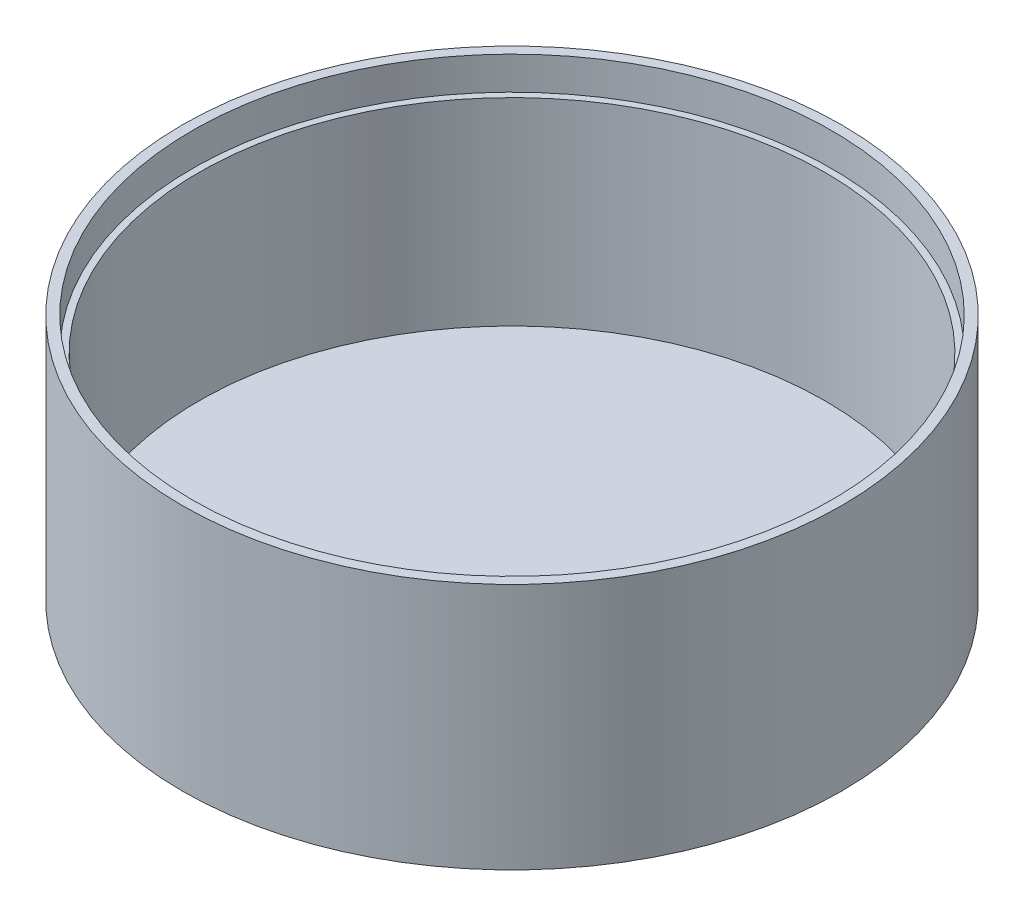
ISO-10303-21;
HEADER;
FILE_DESCRIPTION(('STEP AP214'),'2;1');
FILE_NAME('part.step','',(''),(''),'','','');
FILE_SCHEMA(('AUTOMOTIVE_DESIGN { 1 0 10303 214 1 1 1 1 }'));
ENDSEC;
DATA;
#1=APPLICATION_CONTEXT('core data for automotive mechanical design processes');
#2=APPLICATION_PROTOCOL_DEFINITION('international standard','automotive_design',2000,#1);
#3=PRODUCT_CONTEXT('',#1,'mechanical');
#4=PRODUCT('Part','Part','',(#3));
#5=PRODUCT_RELATED_PRODUCT_CATEGORY('part','',(#4));
#6=PRODUCT_DEFINITION_FORMATION('','',#4);
#7=PRODUCT_DEFINITION_CONTEXT('part definition',#1,'design');
#8=PRODUCT_DEFINITION('design','',#6,#7);
#9=PRODUCT_DEFINITION_SHAPE('','',#8);
#10=(LENGTH_UNIT() NAMED_UNIT(*) SI_UNIT(.MILLI.,.METRE.));
#11=(NAMED_UNIT(*) PLANE_ANGLE_UNIT() SI_UNIT($,.RADIAN.));
#12=(NAMED_UNIT(*) SI_UNIT($,.STERADIAN.) SOLID_ANGLE_UNIT());
#13=UNCERTAINTY_MEASURE_WITH_UNIT(LENGTH_MEASURE(1.E-05),#10,'distance_accuracy_value','');
#14=(GEOMETRIC_REPRESENTATION_CONTEXT(3) GLOBAL_UNCERTAINTY_ASSIGNED_CONTEXT((#13)) GLOBAL_UNIT_ASSIGNED_CONTEXT((#10,
#11,#12)) REPRESENTATION_CONTEXT('',''));
#15=CARTESIAN_POINT('',(0.,0.,0.));
#16=DIRECTION('',(0.,0.,1.));
#17=DIRECTION('',(1.,0.,0.));
#18=AXIS2_PLACEMENT_3D('',#15,#16,#17);
#19=CARTESIAN_POINT('',(0.,30.,0.));
#20=DIRECTION('',(0.,-1.,0.));
#21=DIRECTION('',(0.,0.,-1.));
#22=AXIS2_PLACEMENT_3D('',#19,#20,#21);
#23=CYLINDRICAL_SURFACE('',#22,40.);
#24=CARTESIAN_POINT('',(0.,30.,0.));
#25=DIRECTION('',(0.,1.,0.));
#26=DIRECTION('',(0.,0.,1.));
#27=AXIS2_PLACEMENT_3D('',#24,#25,#26);
#28=CIRCLE('',#27,40.);
#29=CARTESIAN_POINT('',(0.,30.,40.));
#30=VERTEX_POINT('',#29);
#31=EDGE_CURVE('E10',#30,#30,#28,.T.);
#32=ORIENTED_EDGE('',*,*,#31,.F.);
#33=EDGE_LOOP('',(#32));
#34=FACE_BOUND('',#33,.T.);
#35=CARTESIAN_POINT('',(0.,0.,0.));
#36=DIRECTION('',(0.,1.,0.));
#37=DIRECTION('',(0.,0.,1.));
#38=AXIS2_PLACEMENT_3D('',#35,#36,#37);
#39=CIRCLE('',#38,40.);
#40=CARTESIAN_POINT('',(0.,0.,40.));
#41=VERTEX_POINT('',#40);
#42=EDGE_CURVE('E45',#41,#41,#39,.T.);
#43=ORIENTED_EDGE('',*,*,#42,.T.);
#44=EDGE_LOOP('',(#43));
#45=FACE_BOUND('',#44,.T.);
#46=ADVANCED_FACE('F37',(#34,#45),#23,.T.);
#47=CARTESIAN_POINT('',(0.,30.,0.));
#48=DIRECTION('',(0.,1.,0.));
#49=DIRECTION('',(0.,0.,1.));
#50=AXIS2_PLACEMENT_3D('',#47,#48,#49);
#51=PLANE('',#50);
#52=CARTESIAN_POINT('',(0.,30.,0.));
#53=DIRECTION('',(0.,1.,0.));
#54=DIRECTION('',(0.,0.,1.));
#55=AXIS2_PLACEMENT_3D('',#52,#53,#54);
#56=CIRCLE('',#55,38.8);
#57=CARTESIAN_POINT('',(0.,30.,38.8));
#58=VERTEX_POINT('',#57);
#59=EDGE_CURVE('E56',#58,#58,#56,.T.);
#60=ORIENTED_EDGE('',*,*,#59,.F.);
#61=EDGE_LOOP('',(#60));
#62=FACE_BOUND('',#61,.T.);
#63=ORIENTED_EDGE('',*,*,#31,.T.);
#64=EDGE_LOOP('',(#63));
#65=FACE_BOUND('',#64,.T.);
#66=ADVANCED_FACE('F86',(#62,#65),#51,.T.);
#67=CARTESIAN_POINT('',(0.,0.,0.));
#68=DIRECTION('',(0.,1.,0.));
#69=DIRECTION('',(0.,0.,1.));
#70=AXIS2_PLACEMENT_3D('',#67,#68,#69);
#71=PLANE('',#70);
#72=ORIENTED_EDGE('',*,*,#42,.F.);
#73=EDGE_LOOP('',(#72));
#74=FACE_BOUND('',#73,.T.);
#75=ADVANCED_FACE('F82',(#74),#71,.F.);
#76=CARTESIAN_POINT('',(0.,26.,0.));
#77=DIRECTION('',(0.,1.,0.));
#78=DIRECTION('',(0.,0.,1.));
#79=AXIS2_PLACEMENT_3D('',#76,#77,#78);
#80=CYLINDRICAL_SURFACE('',#79,38.8);
#81=CARTESIAN_POINT('',(0.,26.,0.));
#82=DIRECTION('',(0.,1.,0.));
#83=DIRECTION('',(0.,0.,1.));
#84=AXIS2_PLACEMENT_3D('',#81,#82,#83);
#85=CIRCLE('',#84,38.8);
#86=CARTESIAN_POINT('',(0.,26.,38.8));
#87=VERTEX_POINT('',#86);
#88=EDGE_CURVE('E60',#87,#87,#85,.T.);
#89=ORIENTED_EDGE('',*,*,#88,.F.);
#90=EDGE_LOOP('',(#89));
#91=FACE_BOUND('',#90,.T.);
#92=ORIENTED_EDGE('',*,*,#59,.T.);
#93=EDGE_LOOP('',(#92));
#94=FACE_BOUND('',#93,.T.);
#95=ADVANCED_FACE('F74',(#91,#94),#80,.F.);
#96=CARTESIAN_POINT('',(0.,26.,0.));
#97=DIRECTION('',(0.,1.,0.));
#98=DIRECTION('',(0.,0.,1.));
#99=AXIS2_PLACEMENT_3D('',#96,#97,#98);
#100=PLANE('',#99);
#101=CARTESIAN_POINT('',(0.,26.,0.));
#102=DIRECTION('',(0.,1.,0.));
#103=DIRECTION('',(0.,0.,1.));
#104=AXIS2_PLACEMENT_3D('',#101,#102,#103);
#105=CIRCLE('',#104,38.);
#106=CARTESIAN_POINT('',(0.,26.,38.));
#107=VERTEX_POINT('',#106);
#108=EDGE_CURVE('E40',#107,#107,#105,.T.);
#109=ORIENTED_EDGE('',*,*,#108,.F.);
#110=EDGE_LOOP('',(#109));
#111=FACE_BOUND('',#110,.T.);
#112=ORIENTED_EDGE('',*,*,#88,.T.);
#113=EDGE_LOOP('',(#112));
#114=FACE_BOUND('',#113,.T.);
#115=ADVANCED_FACE('F71',(#111,#114),#100,.T.);
#116=CARTESIAN_POINT('',(0.,2.,0.));
#117=DIRECTION('',(0.,1.,0.));
#118=DIRECTION('',(0.,0.,1.));
#119=AXIS2_PLACEMENT_3D('',#116,#117,#118);
#120=PLANE('',#119);
#121=CARTESIAN_POINT('',(0.,2.,0.));
#122=DIRECTION('',(0.,1.,0.));
#123=DIRECTION('',(0.,0.,1.));
#124=AXIS2_PLACEMENT_3D('',#121,#122,#123);
#125=CIRCLE('',#124,38.);
#126=CARTESIAN_POINT('',(0.,2.,38.));
#127=VERTEX_POINT('',#126);
#128=EDGE_CURVE('E51',#127,#127,#125,.T.);
#129=ORIENTED_EDGE('',*,*,#128,.T.);
#130=EDGE_LOOP('',(#129));
#131=FACE_BOUND('',#130,.T.);
#132=ADVANCED_FACE('F73',(#131),#120,.T.);
#133=CARTESIAN_POINT('',(0.,30.,0.));
#134=DIRECTION('',(0.,-1.,0.));
#135=DIRECTION('',(0.,0.,-1.));
#136=AXIS2_PLACEMENT_3D('',#133,#134,#135);
#137=CYLINDRICAL_SURFACE('',#136,38.);
#138=ORIENTED_EDGE('',*,*,#128,.F.);
#139=EDGE_LOOP('',(#138));
#140=FACE_BOUND('',#139,.T.);
#141=ORIENTED_EDGE('',*,*,#108,.T.);
#142=EDGE_LOOP('',(#141));
#143=FACE_BOUND('',#142,.T.);
#144=ADVANCED_FACE('F69',(#140,#143),#137,.F.);
#145=CLOSED_SHELL('',(#46,#66,#75,#95,#115,#132,#144));
#146=MANIFOLD_SOLID_BREP('B2',#145);
#147=ADVANCED_BREP_SHAPE_REPRESENTATION('',(#18,#146),#14);
#148=SHAPE_DEFINITION_REPRESENTATION(#9,#147);
ENDSEC;
END-ISO-10303-21;
